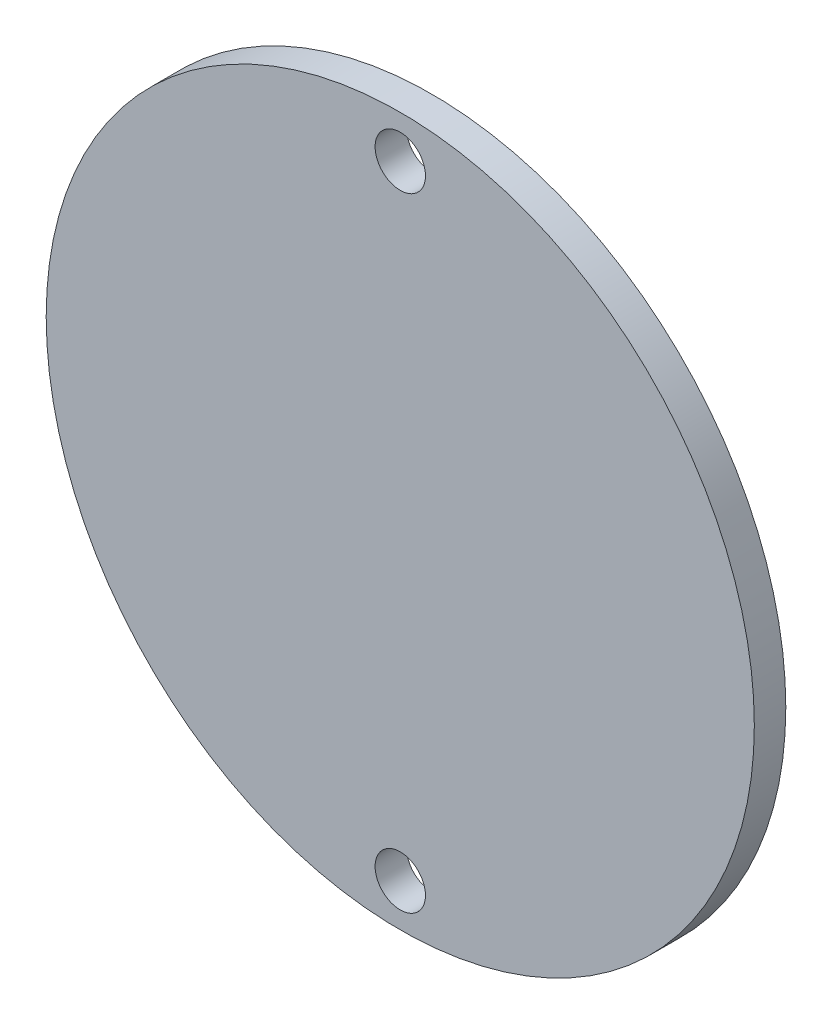
ISO-10303-21;
HEADER;
FILE_DESCRIPTION(('STEP AP214'),'2;1');
FILE_NAME('part.step','',(''),(''),'','','');
FILE_SCHEMA(('AUTOMOTIVE_DESIGN { 1 0 10303 214 1 1 1 1 }'));
ENDSEC;
DATA;
#1=APPLICATION_CONTEXT('core data for automotive mechanical design processes');
#2=APPLICATION_PROTOCOL_DEFINITION('international standard','automotive_design',2000,#1);
#3=PRODUCT_CONTEXT('',#1,'mechanical');
#4=PRODUCT('Part','Part','',(#3));
#5=PRODUCT_RELATED_PRODUCT_CATEGORY('part','',(#4));
#6=PRODUCT_DEFINITION_FORMATION('','',#4);
#7=PRODUCT_DEFINITION_CONTEXT('part definition',#1,'design');
#8=PRODUCT_DEFINITION('design','',#6,#7);
#9=PRODUCT_DEFINITION_SHAPE('','',#8);
#10=(LENGTH_UNIT() NAMED_UNIT(*) SI_UNIT(.MILLI.,.METRE.));
#11=(NAMED_UNIT(*) PLANE_ANGLE_UNIT() SI_UNIT($,.RADIAN.));
#12=(NAMED_UNIT(*) SI_UNIT($,.STERADIAN.) SOLID_ANGLE_UNIT());
#13=UNCERTAINTY_MEASURE_WITH_UNIT(LENGTH_MEASURE(1.E-05),#10,'distance_accuracy_value','');
#14=(GEOMETRIC_REPRESENTATION_CONTEXT(3) GLOBAL_UNCERTAINTY_ASSIGNED_CONTEXT((#13)) GLOBAL_UNIT_ASSIGNED_CONTEXT((#10,
#11,#12)) REPRESENTATION_CONTEXT('',''));
#15=CARTESIAN_POINT('',(0.,0.,0.));
#16=DIRECTION('',(0.,0.,1.));
#17=DIRECTION('',(1.,0.,0.));
#18=AXIS2_PLACEMENT_3D('',#15,#16,#17);
#19=CARTESIAN_POINT('',(0.,0.,2.));
#20=DIRECTION('',(0.,0.,1.));
#21=DIRECTION('',(1.,0.,0.));
#22=AXIS2_PLACEMENT_3D('',#19,#20,#21);
#23=PLANE('',#22);
#24=CARTESIAN_POINT('',(0.,19.8,2.));
#25=DIRECTION('',(0.,0.,1.));
#26=DIRECTION('',(1.,0.,0.));
#27=AXIS2_PLACEMENT_3D('',#24,#25,#26);
#28=CIRCLE('',#27,1.6);
#29=CARTESIAN_POINT('',(1.6,19.8,2.));
#30=VERTEX_POINT('',#29);
#31=EDGE_CURVE('E46',#30,#30,#28,.T.);
#32=ORIENTED_EDGE('',*,*,#31,.F.);
#33=EDGE_LOOP('',(#32));
#34=FACE_BOUND('',#33,.T.);
#35=CARTESIAN_POINT('',(0.,0.,2.));
#36=DIRECTION('',(0.,0.,1.));
#37=DIRECTION('',(1.,0.,0.));
#38=AXIS2_PLACEMENT_3D('',#35,#36,#37);
#39=CIRCLE('',#38,22.5);
#40=CARTESIAN_POINT('',(22.5,0.,2.));
#41=VERTEX_POINT('',#40);
#42=EDGE_CURVE('E10',#41,#41,#39,.T.);
#43=ORIENTED_EDGE('',*,*,#42,.T.);
#44=EDGE_LOOP('',(#43));
#45=FACE_BOUND('',#44,.T.);
#46=CARTESIAN_POINT('',(0.,-19.8,2.));
#47=DIRECTION('',(0.,0.,1.));
#48=DIRECTION('',(1.,0.,0.));
#49=AXIS2_PLACEMENT_3D('',#46,#47,#48);
#50=CIRCLE('',#49,1.6);
#51=CARTESIAN_POINT('',(1.6,-19.8,2.));
#52=VERTEX_POINT('',#51);
#53=EDGE_CURVE('E51',#52,#52,#50,.T.);
#54=ORIENTED_EDGE('',*,*,#53,.F.);
#55=EDGE_LOOP('',(#54));
#56=FACE_BOUND('',#55,.T.);
#57=ADVANCED_FACE('F35',(#34,#45,#56),#23,.T.);
#58=CARTESIAN_POINT('',(0.,0.,0.));
#59=DIRECTION('',(0.,0.,1.));
#60=DIRECTION('',(1.,0.,0.));
#61=AXIS2_PLACEMENT_3D('',#58,#59,#60);
#62=PLANE('',#61);
#63=CARTESIAN_POINT('',(0.,0.,0.));
#64=DIRECTION('',(0.,0.,1.));
#65=DIRECTION('',(1.,0.,0.));
#66=AXIS2_PLACEMENT_3D('',#63,#64,#65);
#67=CIRCLE('',#66,22.5);
#68=CARTESIAN_POINT('',(22.5,0.,0.));
#69=VERTEX_POINT('',#68);
#70=EDGE_CURVE('E39',#69,#69,#67,.T.);
#71=ORIENTED_EDGE('',*,*,#70,.F.);
#72=EDGE_LOOP('',(#71));
#73=FACE_BOUND('',#72,.T.);
#74=CARTESIAN_POINT('',(0.,19.8,0.));
#75=DIRECTION('',(0.,0.,1.));
#76=DIRECTION('',(1.,0.,0.));
#77=AXIS2_PLACEMENT_3D('',#74,#75,#76);
#78=CIRCLE('',#77,1.6);
#79=CARTESIAN_POINT('',(1.6,19.8,0.));
#80=VERTEX_POINT('',#79);
#81=EDGE_CURVE('E48',#80,#80,#78,.T.);
#82=ORIENTED_EDGE('',*,*,#81,.T.);
#83=EDGE_LOOP('',(#82));
#84=FACE_BOUND('',#83,.T.);
#85=CARTESIAN_POINT('',(0.,-19.8,0.));
#86=DIRECTION('',(0.,0.,1.));
#87=DIRECTION('',(1.,0.,0.));
#88=AXIS2_PLACEMENT_3D('',#85,#86,#87);
#89=CIRCLE('',#88,1.6);
#90=CARTESIAN_POINT('',(1.6,-19.8,0.));
#91=VERTEX_POINT('',#90);
#92=EDGE_CURVE('E54',#91,#91,#89,.T.);
#93=ORIENTED_EDGE('',*,*,#92,.T.);
#94=EDGE_LOOP('',(#93));
#95=FACE_BOUND('',#94,.T.);
#96=ADVANCED_FACE('F64',(#73,#84,#95),#62,.F.);
#97=CARTESIAN_POINT('',(0.,0.,2.));
#98=DIRECTION('',(0.,0.,-1.));
#99=DIRECTION('',(-1.,0.,0.));
#100=AXIS2_PLACEMENT_3D('',#97,#98,#99);
#101=CYLINDRICAL_SURFACE('',#100,22.5);
#102=ORIENTED_EDGE('',*,*,#42,.F.);
#103=EDGE_LOOP('',(#102));
#104=FACE_BOUND('',#103,.T.);
#105=ORIENTED_EDGE('',*,*,#70,.T.);
#106=EDGE_LOOP('',(#105));
#107=FACE_BOUND('',#106,.T.);
#108=ADVANCED_FACE('F37',(#104,#107),#101,.T.);
#109=CARTESIAN_POINT('',(0.,19.8,2.));
#110=DIRECTION('',(0.,0.,-1.));
#111=DIRECTION('',(-1.,0.,0.));
#112=AXIS2_PLACEMENT_3D('',#109,#110,#111);
#113=CYLINDRICAL_SURFACE('',#112,1.6);
#114=ORIENTED_EDGE('',*,*,#31,.T.);
#115=EDGE_LOOP('',(#114));
#116=FACE_BOUND('',#115,.T.);
#117=ORIENTED_EDGE('',*,*,#81,.F.);
#118=EDGE_LOOP('',(#117));
#119=FACE_BOUND('',#118,.T.);
#120=ADVANCED_FACE('F73',(#116,#119),#113,.F.);
#121=CARTESIAN_POINT('',(0.,-19.8,2.));
#122=DIRECTION('',(0.,0.,-1.));
#123=DIRECTION('',(-1.,0.,0.));
#124=AXIS2_PLACEMENT_3D('',#121,#122,#123);
#125=CYLINDRICAL_SURFACE('',#124,1.6);
#126=ORIENTED_EDGE('',*,*,#53,.T.);
#127=EDGE_LOOP('',(#126));
#128=FACE_BOUND('',#127,.T.);
#129=ORIENTED_EDGE('',*,*,#92,.F.);
#130=EDGE_LOOP('',(#129));
#131=FACE_BOUND('',#130,.T.);
#132=ADVANCED_FACE('F60',(#128,#131),#125,.F.);
#133=CLOSED_SHELL('',(#57,#96,#108,#120,#132));
#134=MANIFOLD_SOLID_BREP('B2',#133);
#135=ADVANCED_BREP_SHAPE_REPRESENTATION('',(#18,#134),#14);
#136=SHAPE_DEFINITION_REPRESENTATION(#9,#135);
ENDSEC;
END-ISO-10303-21;
